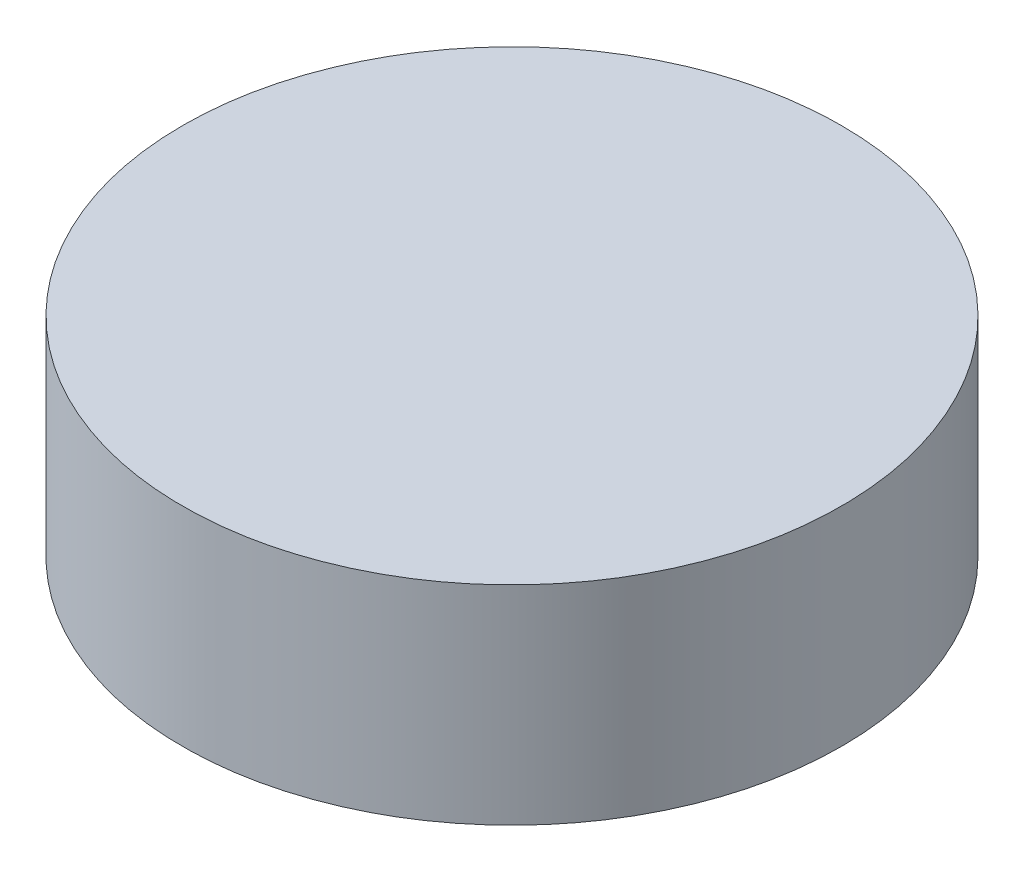
ISO-10303-21;
HEADER;
FILE_DESCRIPTION(('STEP AP214'),'2;1');
FILE_NAME('part.step','',(''),(''),'','','');
FILE_SCHEMA(('AUTOMOTIVE_DESIGN { 1 0 10303 214 1 1 1 1 }'));
ENDSEC;
DATA;
#1=APPLICATION_CONTEXT('core data for automotive mechanical design processes');
#2=APPLICATION_PROTOCOL_DEFINITION('international standard','automotive_design',2000,#1);
#3=PRODUCT_CONTEXT('',#1,'mechanical');
#4=PRODUCT('Part','Part','',(#3));
#5=PRODUCT_RELATED_PRODUCT_CATEGORY('part','',(#4));
#6=PRODUCT_DEFINITION_FORMATION('','',#4);
#7=PRODUCT_DEFINITION_CONTEXT('part definition',#1,'design');
#8=PRODUCT_DEFINITION('design','',#6,#7);
#9=PRODUCT_DEFINITION_SHAPE('','',#8);
#10=(LENGTH_UNIT() NAMED_UNIT(*) SI_UNIT(.MILLI.,.METRE.));
#11=(NAMED_UNIT(*) PLANE_ANGLE_UNIT() SI_UNIT($,.RADIAN.));
#12=(NAMED_UNIT(*) SI_UNIT($,.STERADIAN.) SOLID_ANGLE_UNIT());
#13=UNCERTAINTY_MEASURE_WITH_UNIT(LENGTH_MEASURE(1.E-05),#10,'distance_accuracy_value','');
#14=(GEOMETRIC_REPRESENTATION_CONTEXT(3) GLOBAL_UNCERTAINTY_ASSIGNED_CONTEXT((#13)) GLOBAL_UNIT_ASSIGNED_CONTEXT((#10,
#11,#12)) REPRESENTATION_CONTEXT('',''));
#15=CARTESIAN_POINT('',(0.,0.,0.));
#16=DIRECTION('',(0.,0.,1.));
#17=DIRECTION('',(1.,0.,0.));
#18=AXIS2_PLACEMENT_3D('',#15,#16,#17);
#19=CARTESIAN_POINT('',(118.839586852366,173.620644372415,206.575619137007));
#20=CARTESIAN_POINT('',(119.011400728294,173.620644372415,206.575633664712));
#21=CARTESIAN_POINT('',(119.355113670707,173.620644372415,206.608537742914));
#22=CARTESIAN_POINT('',(119.85025909914,173.620644372414,206.7601771893));
#23=CARTESIAN_POINT('',(120.307765165557,173.620644372415,207.003063848628));
#24=CARTESIAN_POINT('',(120.707167775394,173.620644372414,207.332676578562));
#25=CARTESIAN_POINT('',(121.036938844938,173.620644372415,207.732180481624));
#26=CARTESIAN_POINT('',(121.279799021076,173.620644372414,208.189550617574));
#27=CARTESIAN_POINT('',(121.431584877748,173.620644372415,208.684841239645));
#28=CARTESIAN_POINT('',(121.4809302787,173.620644372414,209.200334922429));
#29=CARTESIAN_POINT('',(121.431622655679,173.620644372415,209.716009667283));
#30=CARTESIAN_POINT('',(121.279940957434,173.620644372414,210.211147412403));
#31=CARTESIAN_POINT('',(121.037046475684,173.620644372415,210.668699540159));
#32=CARTESIAN_POINT('',(120.707429846536,173.620644372414,211.068101096819));
#33=CARTESIAN_POINT('',(120.307926987788,173.620644372414,211.39787244844));
#34=CARTESIAN_POINT('',(119.850556571883,173.620644372414,211.640732548962));
#35=CARTESIAN_POINT('',(119.355266024791,173.620644372414,211.792518425888));
#36=CARTESIAN_POINT('',(118.839772321899,173.620644372414,211.841863821407));
#37=CARTESIAN_POINT('',(118.324097582431,173.620644372414,211.792556199842));
#38=CARTESIAN_POINT('',(117.828959835864,173.620644372414,211.640874501203));
#39=CARTESIAN_POINT('',(117.371407708505,173.620644372414,211.397980019546));
#40=CARTESIAN_POINT('',(116.972006151745,173.620644372414,211.068363390402));
#41=CARTESIAN_POINT('',(116.642234800128,173.620644372414,210.668860531562));
#42=CARTESIAN_POINT('',(116.399374699704,173.620644372414,210.211490116043));
#43=CARTESIAN_POINT('',(116.247588822395,173.620644372414,209.716199567506));
#44=CARTESIAN_POINT('',(116.198243428329,173.620644372414,209.200705870021));
#45=CARTESIAN_POINT('',(116.247551044449,173.620644372414,208.685031110398));
#46=CARTESIAN_POINT('',(116.399232763416,173.620644372414,208.189893439078));
#47=CARTESIAN_POINT('',(116.642127169246,173.620644372414,207.732341031012));
#48=CARTESIAN_POINT('',(116.971744081505,173.620644372414,207.332940522311));
#49=CARTESIAN_POINT('',(117.371245884253,173.620644372415,207.003165261049));
#50=CARTESIAN_POINT('',(117.828662419759,173.620644372414,206.760297364195));
#51=CARTESIAN_POINT('',(118.323945251045,173.620644372414,206.608469086862));
#52=CARTESIAN_POINT('',(118.667677955006,173.620644372415,206.575604601267));
#53=CARTESIAN_POINT('',(118.839586852366,173.620644372415,206.575619137007));
#54=B_SPLINE_CURVE_WITH_KNOTS('',3,(#19,#20,#21,#22,#23,#24,#25,#26,#27,#28,#29,#30,#31,#32,#33,
#34,#35,#36,#37,#38,#39,#40,#41,#42,#43,#44,#45,#46,#47,#48,#49,#50,#51,#52,#53),.UNSPECIFIED.,
.T.,.F.,(4,1,1,1,1,1,1,1,1,1,1,1,1,1,1,1,1,1,1,1,1,1,1,1,1,1,1,1,1,1,1,1,4),(0.,
0.0312413569188765,0.0624996653087882,0.0937327224681811,0.124999665238835,0.156232722397082,
0.187499665168914,0.218732722326993,0.249999665098999,0.281232722256907,0.31249966502908,
0.343732722187167,0.374999664959178,0.406232722117624,0.437499664889266,0.468732722048057,
0.499999664819363,0.531232721978932,0.562499664749468,0.593732721908671,0.624999664679522,
0.65623272183825,0.68749966460962,0.718732721768162,0.749999664539686,0.781232721698474,
0.812499664469802,0.8437327216291,0.874999664399879,0.906232721559641,0.93749966432999,
0.968741365090905,1.),.UNSPECIFIED.);
#55=DIRECTION('',(0.,-1.,0.));
#56=VECTOR('',#55,1.);
#57=SURFACE_OF_LINEAR_EXTRUSION('',#54,#56);
#58=CARTESIAN_POINT('',(118.839586819237,173.620644372414,206.575619137004));
#59=CARTESIAN_POINT('',(118.873958134056,173.620644372414,206.57562210794));
#60=CARTESIAN_POINT('',(118.908329898704,173.620644372414,206.576282602033));
#61=CARTESIAN_POINT('',(118.97701892004,173.620644372414,206.578928851347));
#62=CARTESIAN_POINT('',(119.011336181743,173.620644372414,206.580914476634));
#63=CARTESIAN_POINT('',(119.079862359489,173.620644372414,206.5862207978));
#64=CARTESIAN_POINT('',(119.114071291156,173.620644372414,206.589541291418));
#65=CARTESIAN_POINT('',(119.182326555705,173.620644372414,206.597527191342));
#66=CARTESIAN_POINT('',(119.21637291325,173.620644372414,206.602192386598));
#67=CARTESIAN_POINT('',(119.28424899359,173.620644372414,206.612877481596));
#68=CARTESIAN_POINT('',(119.318078739066,173.620644372414,206.61889723704));
#69=CARTESIAN_POINT('',(119.385466972912,173.620644372414,206.632300997284));
#70=CARTESIAN_POINT('',(119.419025460525,173.620644372414,206.639685005896));
#71=CARTESIAN_POINT('',(119.485824330512,173.620644372414,206.65578735797));
#72=CARTESIAN_POINT('',(119.519064677642,173.620644372414,206.664505847489));
#73=CARTESIAN_POINT('',(119.585180936081,173.620644372414,206.683247475732));
#74=CARTESIAN_POINT('',(119.618056789501,173.620644372414,206.693270818558));
#75=CARTESIAN_POINT('',(119.683397614312,173.620644372414,206.714592529377));
#76=CARTESIAN_POINT('',(119.71586252394,173.620644372414,206.725891086556));
#77=CARTESIAN_POINT('',(119.780334974551,173.620644372414,206.749733659134));
#78=CARTESIAN_POINT('',(119.812342472652,173.620644372414,206.762277790437));
#79=CARTESIAN_POINT('',(119.875853812011,173.620644372414,206.788582102222));
#80=CARTESIAN_POINT('',(119.907357653416,173.620644372414,206.802342282351));
#81=CARTESIAN_POINT('',(119.969807933525,173.620644372414,206.83106719086));
#82=CARTESIAN_POINT('',(120.000754424424,173.620644372414,206.846031805723));
#83=CARTESIAN_POINT('',(120.062036018224,173.620644372414,206.877153955306));
#84=CARTESIAN_POINT('',(120.092371211881,173.620644372414,206.89331131126));
#85=CARTESIAN_POINT('',(120.152376269735,173.620644372414,206.92680725957));
#86=CARTESIAN_POINT('',(120.182046237537,173.620644372414,206.944145666262));
#87=CARTESIAN_POINT('',(120.240666999149,173.620644372414,206.979992059081));
#88=CARTESIAN_POINT('',(120.269617870383,173.620644372414,206.998499918528));
#89=CARTESIAN_POINT('',(120.32674622174,173.620644372414,207.036673088376));
#90=CARTESIAN_POINT('',(120.354923701478,173.620644372414,207.056338399352));
#91=CARTESIAN_POINT('',(120.410473680635,173.620644372414,207.096780555853));
#92=CARTESIAN_POINT('',(120.437846091613,173.620644372414,207.117557522797));
#93=CARTESIAN_POINT('',(120.491754743097,173.620644372414,207.160177540275));
#94=CARTESIAN_POINT('',(120.518290850587,173.620644372414,207.182020759006));
#95=CARTESIAN_POINT('',(120.570495578528,173.620644372414,207.226727833512));
#96=CARTESIAN_POINT('',(120.596164067759,173.620644372414,207.249591842469));
#97=CARTESIAN_POINT('',(120.646602179985,173.620644372414,207.296295091098));
#98=CARTESIAN_POINT('',(120.671371718085,173.620644372414,207.320134422426));
#99=CARTESIAN_POINT('',(120.719980682547,173.620644372414,207.368743144521));
#100=CARTESIAN_POINT('',(120.743820110013,173.620644372414,207.393512534184));
#101=CARTESIAN_POINT('',(120.790523453261,173.620644372414,207.443950354582));
#102=CARTESIAN_POINT('',(120.813387462656,173.620644372414,207.469618698611));
#103=CARTESIAN_POINT('',(120.858094399393,173.620644372414,207.521823199361));
#104=CARTESIAN_POINT('',(120.87993748123,173.620644372414,207.548359223737));
#105=CARTESIAN_POINT('',(120.922557055788,173.620644372414,207.602267823083));
#106=CARTESIAN_POINT('',(120.943333717053,173.620644372414,207.629640264761));
#107=CARTESIAN_POINT('',(120.983775023389,173.620644372414,207.685190498145));
#108=CARTESIAN_POINT('',(121.0034397889,173.620644372414,207.713368202126));
#109=CARTESIAN_POINT('',(121.041611705294,173.620644372414,207.770497165046));
#110=CARTESIAN_POINT('',(121.060118854157,173.620644372414,207.799448425333));
#111=CARTESIAN_POINT('',(121.095963970016,173.620644372414,207.858069951767));
#112=CARTESIAN_POINT('',(121.113301807016,173.620644372414,207.887740297359));
#113=CARTESIAN_POINT('',(121.146796914772,173.620644372414,207.947746021489));
#114=CARTESIAN_POINT('',(121.162953996774,173.620644372414,207.978081505352));
#115=CARTESIAN_POINT('',(121.19407609125,173.620644372414,208.039363488099));
#116=CARTESIAN_POINT('',(121.20904092296,173.620644372414,208.070310078752));
#117=CARTESIAN_POINT('',(121.237766940125,173.620644372414,208.132760270449));
#118=CARTESIAN_POINT('',(121.251528011985,173.620644372414,208.164263923725));
#119=CARTESIAN_POINT('',(121.277834968325,173.620644372414,208.227774510877));
#120=CARTESIAN_POINT('',(121.290380854992,173.620644372414,208.259781443846));
#121=CARTESIAN_POINT('',(121.314227354229,173.620644372414,208.324252567191));
#122=CARTESIAN_POINT('',(121.325528087286,173.620644372414,208.356716712981));
#123=CARTESIAN_POINT('',(121.346854118255,173.620644372414,208.422055983943));
#124=CARTESIAN_POINT('',(121.356879610171,173.620644372414,208.454931045764));
#125=CARTESIAN_POINT('',(121.375625069264,173.620644372414,208.521045864024));
#126=CARTESIAN_POINT('',(121.384345243521,173.620644372414,208.554285561716));
#127=CARTESIAN_POINT('',(121.400450028087,173.620644372414,208.621083454412));
#128=CARTESIAN_POINT('',(121.407834783256,173.620644372414,208.654641614456));
#129=CARTESIAN_POINT('',(121.42123875942,173.620644372414,208.722029617339));
#130=CARTESIAN_POINT('',(121.427257977719,173.620644372414,208.755859460716));
#131=CARTESIAN_POINT('',(121.43794107181,173.620644372414,208.823736005418));
#132=CARTESIAN_POINT('',(121.442604796777,173.620644372414,208.857782730446));
#133=CARTESIAN_POINT('',(121.450587043586,173.620644372414,208.926038814098));
#134=CARTESIAN_POINT('',(121.453905350508,173.620644372414,208.960248197823));
#135=CARTESIAN_POINT('',(121.459206807997,173.620644372414,209.028775287364));
#136=CARTESIAN_POINT('',(121.461189756319,173.620644372414,209.063093008797));
#137=CARTESIAN_POINT('',(121.463830470424,173.620644372414,209.131782446426));
#138=CARTESIAN_POINT('',(121.46448811127,173.620644372414,209.166154167407));
#139=CARTESIAN_POINT('',(121.464488111899,173.620644372414,209.234897545085));
#140=CARTESIAN_POINT('',(121.463830474153,173.620644372414,209.269269201783));
#141=CARTESIAN_POINT('',(121.461189732611,173.620644372414,209.337958417543));
#142=CARTESIAN_POINT('',(121.459206757296,173.620644372414,209.372275981527));
#143=CARTESIAN_POINT('',(121.453905184574,173.620644372414,209.440802715296));
#144=CARTESIAN_POINT('',(121.450586790719,173.620644372414,209.475011900799));
#145=CARTESIAN_POINT('',(121.442604293466,173.620644372414,209.543267602171));
#146=CARTESIAN_POINT('',(121.437940403904,173.620644372414,209.577314143015));
#147=CARTESIAN_POINT('',(121.427256840865,173.620644372414,209.645190379715));
#148=CARTESIAN_POINT('',(121.421237314599,173.620644372414,209.679020098707));
#149=CARTESIAN_POINT('',(121.407832703776,173.620644372414,209.746407972305));
#150=CARTESIAN_POINT('',(121.400447616488,173.620644372414,209.779966126368));
#151=CARTESIAN_POINT('',(121.38434228023,173.620644372414,209.846764118705));
#152=CARTESIAN_POINT('',(121.375621882813,173.620644372414,209.88000392115));
#153=CARTESIAN_POINT('',(121.35687604481,173.620644372414,209.946118993415));
#154=CARTESIAN_POINT('',(121.346850396035,173.620644372414,209.978994204172));
#155=CARTESIAN_POINT('',(121.32552412162,173.620644372414,210.04433376026));
#156=CARTESIAN_POINT('',(121.314223303144,173.620644372414,210.076798042622));
#157=CARTESIAN_POINT('',(121.290376694284,173.620644372414,210.141269366585));
#158=CARTESIAN_POINT('',(121.277830786643,173.620644372414,210.173276364795));
#159=CARTESIAN_POINT('',(121.251523834888,173.620644372414,210.236786965356));
#160=CARTESIAN_POINT('',(121.237762793064,173.620644372414,210.268290568655));
#161=CARTESIAN_POINT('',(121.209036840875,173.620644372414,210.330740561463));
#162=CARTESIAN_POINT('',(121.194072047335,173.620644372414,210.36168700469));
#163=CARTESIAN_POINT('',(121.162949987102,173.620644372414,210.422968627387));
#164=CARTESIAN_POINT('',(121.146792902457,173.620644372414,210.453303899278));
#165=CARTESIAN_POINT('',(121.11329771068,173.620644372414,210.513309175103));
#166=CARTESIAN_POINT('',(121.095959791554,173.620644372414,210.542979283943));
#167=CARTESIAN_POINT('',(121.06011435527,173.620644372414,210.60160032694));
#168=CARTESIAN_POINT('',(121.041606965265,173.620644372414,210.630551338804));
#169=CARTESIAN_POINT('',(121.003434497046,173.620644372414,210.687679893277));
#170=CARTESIAN_POINT('',(120.983769416515,173.620644372414,210.715857434336));
#171=CARTESIAN_POINT('',(120.943327541042,173.620644372414,210.771407486809));
#172=CARTESIAN_POINT('',(120.922550622662,173.620644372414,210.798779908312));
#173=CARTESIAN_POINT('',(120.879930583801,173.620644372414,210.85268854872));
#174=CARTESIAN_POINT('',(120.858087293579,173.620644372414,210.879224633388));
#175=CARTESIAN_POINT('',(120.813380019484,173.620644372414,210.93142930006));
#176=CARTESIAN_POINT('',(120.790515881551,173.620644372414,210.957097750092));
#177=CARTESIAN_POINT('',(120.743812380087,173.620644372414,211.007535784653));
#178=CARTESIAN_POINT('',(120.719972924829,173.620644372414,211.032305284222));
#179=CARTESIAN_POINT('',(120.671364015863,173.620644372414,211.080914193614));
#180=CARTESIAN_POINT('',(120.646594563909,173.620644372414,211.104753605191));
#181=CARTESIAN_POINT('',(120.596156666991,173.620644372414,211.151456929371));
#182=CARTESIAN_POINT('',(120.570488309405,173.620644372414,211.17432093631));
#183=CARTESIAN_POINT('',(120.518283813212,173.620644372414,211.219027876383));
#184=CARTESIAN_POINT('',(120.491747807428,173.620644372414,211.240870964571));
#185=CARTESIAN_POINT('',(120.437839260388,173.620644372414,211.283490555753));
#186=CARTESIAN_POINT('',(120.410466852679,173.620644372414,211.304267227615));
#187=CARTESIAN_POINT('',(120.354916685816,173.620644372414,211.344708554779));
#188=CARTESIAN_POINT('',(120.326739014398,173.620644372414,211.364373330534));
#189=CARTESIAN_POINT('',(120.269610100987,173.620644372414,211.402545261534));
#190=CARTESIAN_POINT('',(120.240658857446,173.620644372414,211.421052414461));
#191=CARTESIAN_POINT('',(120.182037351681,173.620644372414,211.456897535222));
#192=CARTESIAN_POINT('',(120.152367009821,173.620644372414,211.47423537275));
#193=CARTESIAN_POINT('',(120.092361284682,173.620644372414,211.507730479463));
#194=CARTESIAN_POINT('',(120.062025795953,173.620644372414,211.523887559672));
#195=CARTESIAN_POINT('',(120.000743799419,173.620644372414,211.555009649588));
#196=CARTESIAN_POINT('',(119.969797199784,173.620644372414,211.569974478411));
#197=CARTESIAN_POINT('',(119.90734699048,173.620644372414,211.598700489936));
#198=CARTESIAN_POINT('',(119.875843328581,173.620644372414,211.612461559043));
#199=CARTESIAN_POINT('',(119.812332728185,173.620644372414,211.638768511378));
#200=CARTESIAN_POINT('',(119.780325790639,173.620644372414,211.651314396898));
#201=CARTESIAN_POINT('',(119.715854661603,173.620644372414,211.675160894668));
#202=CARTESIAN_POINT('',(119.683390514737,173.620644372414,211.686461627511));
#203=CARTESIAN_POINT('',(119.618051243912,173.620644372414,211.707787658589));
#204=CARTESIAN_POINT('',(119.585176183329,173.620644372414,211.717813150904));
#205=CARTESIAN_POINT('',(119.519061368645,173.620644372414,211.736558611036));
#206=CARTESIAN_POINT('',(119.485821673302,173.620644372414,211.745278785974));
#207=CARTESIAN_POINT('',(119.419023785215,173.620644372414,211.761383571853));
#208=CARTESIAN_POINT('',(119.385465627432,173.620644372414,211.768768327654));
#209=CARTESIAN_POINT('',(119.318077628037,173.620644372414,211.782172304718));
#210=CARTESIAN_POINT('',(119.284247785881,173.620644372414,211.788191523248));
#211=CARTESIAN_POINT('',(119.216371242689,173.620644372414,211.798874617592));
#212=CARTESIAN_POINT('',(119.182324517945,173.620644372414,211.803538342544));
#213=CARTESIAN_POINT('',(119.114068434247,173.620644372414,211.811520589188));
#214=CARTESIAN_POINT('',(119.079859050189,173.620644372414,211.814838895934));
#215=CARTESIAN_POINT('',(119.011331959686,173.620644372414,211.82014035301));
#216=CARTESIAN_POINT('',(118.977014237622,173.620644372414,211.822123301084));
#217=CARTESIAN_POINT('',(118.908324798756,173.620644372414,211.824764014706));
#218=CARTESIAN_POINT('',(118.873953077168,173.620644372414,211.825421655317));
#219=CARTESIAN_POINT('',(118.80520969855,173.620644372414,211.825421655562));
#220=CARTESIAN_POINT('',(118.770838041521,173.620644372414,211.824764017676));
#221=CARTESIAN_POINT('',(118.70214882535,173.620644372414,211.82212327591));
#222=CARTESIAN_POINT('',(118.667831261289,173.620644372414,211.820140300521));
#223=CARTESIAN_POINT('',(118.599304527536,173.620644372414,211.814838727686));
#224=CARTESIAN_POINT('',(118.565095342124,173.620644372414,211.811520333801));
#225=CARTESIAN_POINT('',(118.496839641021,173.620644372414,211.8035378365));
#226=CARTESIAN_POINT('',(118.462793100352,173.620644372414,211.798873946926));
#227=CARTESIAN_POINT('',(118.394916864001,173.620644372414,211.788190383858));
#228=CARTESIAN_POINT('',(118.361087145183,173.620644372414,211.782170857575));
#229=CARTESIAN_POINT('',(118.29369927186,173.620644372414,211.7687662467));
#230=CARTESIAN_POINT('',(118.2601411179,173.620644372414,211.761381159374));
#231=CARTESIAN_POINT('',(118.193343125703,173.620644372414,211.745275823026));
#232=CARTESIAN_POINT('',(118.160103323295,173.620644372414,211.736555425555));
#233=CARTESIAN_POINT('',(118.093988251062,173.620644372414,211.717809587434));
#234=CARTESIAN_POINT('',(118.061113040299,173.620644372414,211.707783938594));
#235=CARTESIAN_POINT('',(117.995773484179,173.620644372414,211.686457664047));
#236=CARTESIAN_POINT('',(117.963309201792,173.620644372414,211.675156845502));
#237=CARTESIAN_POINT('',(117.898837877782,173.620644372414,211.651310236507));
#238=CARTESIAN_POINT('',(117.866830879549,173.620644372414,211.6387643288));
#239=CARTESIAN_POINT('',(117.803320278966,173.620644372414,211.612457376917));
#240=CARTESIAN_POINT('',(117.771816675667,173.620644372414,211.598696335032));
#241=CARTESIAN_POINT('',(117.709366682878,173.620644372414,211.569970382726));
#242=CARTESIAN_POINT('',(117.678420239672,173.620644372414,211.555005589131));
#243=CARTESIAN_POINT('',(117.61713861703,173.620644372414,211.523883528789));
#244=CARTESIAN_POINT('',(117.586803345174,173.620644372414,211.507726444092));
#245=CARTESIAN_POINT('',(117.526798069428,173.620644372414,211.474231252214));
#246=CARTESIAN_POINT('',(117.49712796063,173.620644372414,211.456893333038));
#247=CARTESIAN_POINT('',(117.438506917723,173.620644372414,211.421047896656));
#248=CARTESIAN_POINT('',(117.409555905904,173.620644372414,211.402540506602));
#249=CARTESIAN_POINT('',(117.352427351518,173.620644372414,211.364368038286));
#250=CARTESIAN_POINT('',(117.324249810501,173.620644372414,211.344702957706));
#251=CARTESIAN_POINT('',(117.268699758108,173.620644372414,211.304261082138));
#252=CARTESIAN_POINT('',(117.241327336644,173.620644372414,211.283484163711));
#253=CARTESIAN_POINT('',(117.18741869631,173.620644372414,211.240864124756));
#254=CARTESIAN_POINT('',(117.160882611679,173.620644372414,211.219020834488));
#255=CARTESIAN_POINT('',(117.108677945079,173.620644372414,211.174313560302));
#256=CARTESIAN_POINT('',(117.083009495083,173.620644372414,211.151449422323));
#257=CARTESIAN_POINT('',(117.032571460595,173.620644372414,211.104745920768));
#258=CARTESIAN_POINT('',(117.007801961063,173.620644372414,211.080906465465));
#259=CARTESIAN_POINT('',(116.959193051748,173.620644372414,211.03229755641));
#260=CARTESIAN_POINT('',(116.93535364021,173.620644372414,211.007528104412));
#261=CARTESIAN_POINT('',(116.888650316114,173.620644372414,210.957090207407));
#262=CARTESIAN_POINT('',(116.865786309219,173.620644372414,210.931421849777));
#263=CARTESIAN_POINT('',(116.821079369236,173.620644372414,210.879217353502));
#264=CARTESIAN_POINT('',(116.799236281095,173.620644372414,210.852681347678));
#265=CARTESIAN_POINT('',(116.75661669001,173.620644372414,210.798772800564));
#266=CARTESIAN_POINT('',(116.735840018197,173.620644372414,210.771400392819));
#267=CARTESIAN_POINT('',(116.695398691137,173.620644372414,210.715850225893));
#268=CARTESIAN_POINT('',(116.675733915436,173.620644372414,210.687672554446));
#269=CARTESIAN_POINT('',(116.637561984545,173.620644372414,210.630543640984));
#270=CARTESIAN_POINT('',(116.619054831673,173.620644372414,210.601592397422));
#271=CARTESIAN_POINT('',(116.583209711024,173.620644372414,210.542970891617));
#272=CARTESIAN_POINT('',(116.565871873552,173.620644372414,210.513300549739));
#273=CARTESIAN_POINT('',(116.532376766948,173.620644372414,210.453294824558));
#274=CARTESIAN_POINT('',(116.516219686794,173.620644372414,210.422959335807));
#275=CARTESIAN_POINT('',(116.485097596985,173.620644372414,210.361677339218));
#276=CARTESIAN_POINT('',(116.470132768214,173.620644372414,210.330730739551));
#277=CARTESIAN_POINT('',(116.441406756788,173.620644372414,210.268280530168));
#278=CARTESIAN_POINT('',(116.427645687728,173.620644372414,210.23677686822));
#279=CARTESIAN_POINT('',(116.401338735484,173.620644372414,210.173266267711));
#280=CARTESIAN_POINT('',(116.388792850008,173.620644372414,210.1412593301));
#281=CARTESIAN_POINT('',(116.364946352326,173.620644372414,210.076788200933));
#282=CARTESIAN_POINT('',(116.353645619527,173.620644372414,210.044324054003));
#283=CARTESIAN_POINT('',(116.332319588546,173.620644372414,209.978984783074));
#284=CARTESIAN_POINT('',(116.322294096283,173.620644372414,209.94610972245));
#285=CARTESIAN_POINT('',(116.303548636268,173.620644372414,209.879994907731));
#286=CARTESIAN_POINT('',(116.294828461394,173.620644372414,209.846755212395));
#287=CARTESIAN_POINT('',(116.278723675664,173.620644372414,209.779957324392));
#288=CARTESIAN_POINT('',(116.271338919947,173.620644372414,209.746399166687));
#289=CARTESIAN_POINT('',(116.257934943074,173.620644372414,209.67901116752));
#290=CARTESIAN_POINT('',(116.251915724649,173.620644372414,209.645181325516));
#291=CARTESIAN_POINT('',(116.241232630519,173.620644372414,209.577304782635));
#292=CARTESIAN_POINT('',(116.236568905675,173.620644372414,209.543258058051));
#293=CARTESIAN_POINT('',(116.228586659224,173.620644372414,209.475001974593));
#294=CARTESIAN_POINT('',(116.225268352566,173.620644372414,209.440792590614));
#295=CARTESIAN_POINT('',(116.219966895616,173.620644372414,209.372265500106));
#296=CARTESIAN_POINT('',(116.217983947586,173.620644372414,209.337947777957));
#297=CARTESIAN_POINT('',(116.215343233977,173.620644372414,209.26925833867));
#298=CARTESIAN_POINT('',(116.214685593344,173.620644372414,209.234886616746));
#299=CARTESIAN_POINT('',(116.214685592949,173.620644372414,209.166143237185));
#300=CARTESIAN_POINT('',(116.215343230717,173.620644372414,209.131771579549));
#301=CARTESIAN_POINT('',(116.217983972235,173.620644372414,209.063082362148));
#302=CARTESIAN_POINT('',(116.219966947494,173.620644372414,209.028764797462));
#303=CARTESIAN_POINT('',(116.225268520155,173.620644372414,208.960238062765));
#304=CARTESIAN_POINT('',(116.228586913985,173.620644372414,208.926028877033));
#305=CARTESIAN_POINT('',(116.236569411362,173.620644372414,208.857773175917));
#306=CARTESIAN_POINT('',(116.241233301044,173.620644372414,208.823726635554));
#307=CARTESIAN_POINT('',(116.251916864611,173.620644372414,208.755850400765));
#308=CARTESIAN_POINT('',(116.25793639125,173.620644372414,208.722020683198));
#309=CARTESIAN_POINT('',(116.271341003275,173.620644372414,208.654632813432));
#310=CARTESIAN_POINT('',(116.278726091358,173.620644372414,208.62107466177));
#311=CARTESIAN_POINT('',(116.294831429263,173.620644372414,208.554276674256));
#312=CARTESIAN_POINT('',(116.303551827535,173.620644372414,208.521036874234));
#313=CARTESIAN_POINT('',(116.322297666931,173.620644372414,208.454921805648));
#314=CARTESIAN_POINT('',(116.332323316285,173.620644372414,208.422046596158));
#315=CARTESIAN_POINT('',(116.353649591168,173.620644372414,208.35670704024));
#316=CARTESIAN_POINT('',(116.36495040961,173.620644372414,208.324242756808));
#317=CARTESIAN_POINT('',(116.388797017353,173.620644372414,208.259771427161));
#318=CARTESIAN_POINT('',(116.401342924017,173.620644372414,208.227764424375));
#319=CARTESIAN_POINT('',(116.427649872099,173.620644372414,208.164253810591));
#320=CARTESIAN_POINT('',(116.441410911329,173.620644372414,208.132750198687));
#321=CARTESIAN_POINT('',(116.470136858193,173.620644372414,208.070300188343));
#322=CARTESIAN_POINT('',(116.485101649,173.620644372414,208.039353736185));
#323=CARTESIAN_POINT('',(116.516223704987,173.620644372414,207.978072099851));
#324=CARTESIAN_POINT('',(116.532380787998,173.620644372414,207.947736823193));
#325=CARTESIAN_POINT('',(116.565875979057,173.620644372414,207.887731546618));
#326=CARTESIAN_POINT('',(116.583213898877,173.620644372414,207.858061441667));
#327=CARTESIAN_POINT('',(116.619059340422,173.620644372414,207.799440419738));
#328=CARTESIAN_POINT('',(116.637566734684,173.620644372414,207.77048942486));
#329=CARTESIAN_POINT('',(116.675739217904,173.620644372414,207.713360920403));
#330=CARTESIAN_POINT('',(116.695404308881,173.620644372414,207.685183412174));
#331=CARTESIAN_POINT('',(116.735846205552,173.620644372414,207.62963342669));
#332=CARTESIAN_POINT('',(116.7566231347,173.620644372414,207.602261039358));
#333=CARTESIAN_POINT('',(116.799243190499,173.620644372414,207.548352451572));
#334=CARTESIAN_POINT('',(116.821086487216,173.620644372414,207.521816385614));
#335=CARTESIAN_POINT('',(116.865793764894,173.620644372414,207.469611723615));
#336=CARTESIAN_POINT('',(116.888657900477,173.620644372414,207.443943260026));
#337=CARTESIAN_POINT('',(116.935361383036,173.620644372414,207.393505148804));
#338=CARTESIAN_POINT('',(116.959200822465,173.620644372414,207.368735586803));
#339=CARTESIAN_POINT('',(117.007809676406,173.620644372414,207.320126490104));
#340=CARTESIAN_POINT('',(117.032579089818,173.620644372414,207.296286954305));
#341=CARTESIAN_POINT('',(117.083016909075,173.620644372414,207.249583376818));
#342=CARTESIAN_POINT('',(117.108685227477,173.620644372414,207.226719240722));
#343=CARTESIAN_POINT('',(117.160889662548,173.620644372414,207.182012101109));
#344=CARTESIAN_POINT('',(117.187425645636,173.620644372414,207.160168941653));
#345=CARTESIAN_POINT('',(117.241334182008,173.620644372414,207.11754933017));
#346=CARTESIAN_POINT('',(117.268706600515,173.620644372414,207.09677270772));
#347=CARTESIAN_POINT('',(117.324256841631,173.620644372414,207.056331664425));
#348=CARTESIAN_POINT('',(117.352434575025,173.620644372414,207.036667121096));
#349=CARTESIAN_POINT('',(117.409563692982,173.620644372414,206.998495896111));
#350=CARTESIAN_POINT('',(117.438515077929,173.620644372414,206.97998921503));
#351=CARTESIAN_POINT('',(117.497136866268,173.620644372414,206.944145054614));
#352=CARTESIAN_POINT('',(117.526807349588,173.620644372414,206.926807706067));
#353=CARTESIAN_POINT('',(117.586813293222,173.620644372414,206.893313357529));
#354=CARTESIAN_POINT('',(117.617148860294,173.620644372414,206.877156548865));
#355=CARTESIAN_POINT('',(117.678430885475,173.620644372414,206.846034547111));
#356=CARTESIAN_POINT('',(117.709377437085,173.620644372414,206.831069538195));
#357=CARTESIAN_POINT('',(117.771827357811,173.620644372414,206.80234247809));
#358=CARTESIAN_POINT('',(117.803330780684,173.620644372414,206.788580543811));
#359=CARTESIAN_POINT('',(117.866840639714,173.620644372414,206.762270942132));
#360=CARTESIAN_POINT('',(117.898847075726,173.620644372414,206.749723274383));
#361=CARTESIAN_POINT('',(117.963317074523,173.620644372414,206.725872727691));
#362=CARTESIAN_POINT('',(117.995780592171,173.620644372414,206.714569726796));
#363=CARTESIAN_POINT('',(118.061118590322,173.620644372414,206.693239119305));
#364=CARTESIAN_POINT('',(118.093993006234,173.620644372414,206.683211314958));
#365=CARTESIAN_POINT('',(118.160106631244,173.620644372414,206.664461635153));
#366=CARTESIAN_POINT('',(118.193345780401,173.620644372414,206.655739548463));
#367=CARTESIAN_POINT('',(118.260142787757,173.620644372414,206.639631774469));
#368=CARTESIAN_POINT('',(118.293700610405,173.620644372414,206.632245939896));
#369=CARTESIAN_POINT('',(118.36108825,173.620644372414,206.618841117477));
#370=CARTESIAN_POINT('',(118.394918067706,173.620644372414,206.612822133448));
#371=CARTESIAN_POINT('',(118.462794760994,173.620644372414,206.602140580709));
#372=CARTESIAN_POINT('',(118.49684166074,173.620644372414,206.597478165795));
#373=CARTESIAN_POINT('',(118.565098204723,173.620644372414,206.589499339827));
#374=CARTESIAN_POINT('',(118.599307874385,173.620644372414,206.586183146537));
#375=CARTESIAN_POINT('',(118.667835436689,173.620644372414,206.580886430054));
#376=CARTESIAN_POINT('',(118.702153345024,173.620644372414,206.578906110433));
#377=CARTESIAN_POINT('',(118.770843299445,173.620644372414,206.576270984594));
#378=CARTESIAN_POINT('',(118.805215350276,173.620644372414,206.575616301895));
#379=CARTESIAN_POINT('',(118.839586819237,173.620644372414,206.575619137004));
#380=B_SPLINE_CURVE_WITH_KNOTS('',3,(#58,#59,#60,#61,#62,#63,#64,#65,#66,#67,#68,#69,#70,#71,
#72,#73,#74,#75,#76,#77,#78,#79,#80,#81,#82,#83,#84,#85,#86,#87,#88,#89,#90,#91,#92,#93,#94,#95,
#96,#97,#98,#99,#100,#101,#102,#103,#104,#105,#106,#107,#108,#109,#110,#111,#112,#113,#114,#115,
#116,#117,#118,#119,#120,#121,#122,#123,#124,#125,#126,#127,#128,#129,#130,#131,#132,#133,#134,
#135,#136,#137,#138,#139,#140,#141,#142,#143,#144,#145,#146,#147,#148,#149,#150,#151,#152,#153,
#154,#155,#156,#157,#158,#159,#160,#161,#162,#163,#164,#165,#166,#167,#168,#169,#170,#171,#172,
#173,#174,#175,#176,#177,#178,#179,#180,#181,#182,#183,#184,#185,#186,#187,#188,#189,#190,#191,
#192,#193,#194,#195,#196,#197,#198,#199,#200,#201,#202,#203,#204,#205,#206,#207,#208,#209,#210,
#211,#212,#213,#214,#215,#216,#217,#218,#219,#220,#221,#222,#223,#224,#225,#226,#227,#228,#229,
#230,#231,#232,#233,#234,#235,#236,#237,#238,#239,#240,#241,#242,#243,#244,#245,#246,#247,#248,
#249,#250,#251,#252,#253,#254,#255,#256,#257,#258,#259,#260,#261,#262,#263,#264,#265,#266,#267,
#268,#269,#270,#271,#272,#273,#274,#275,#276,#277,#278,#279,#280,#281,#282,#283,#284,#285,#286,
#287,#288,#289,#290,#291,#292,#293,#294,#295,#296,#297,#298,#299,#300,#301,#302,#303,#304,#305,
#306,#307,#308,#309,#310,#311,#312,#313,#314,#315,#316,#317,#318,#319,#320,#321,#322,#323,#324,
#325,#326,#327,#328,#329,#330,#331,#332,#333,#334,#335,#336,#337,#338,#339,#340,#341,#342,#343,
#344,#345,#346,#347,#348,#349,#350,#351,#352,#353,#354,#355,#356,#357,#358,#359,#360,#361,#362,
#363,#364,#365,#366,#367,#368,#369,#370,#371,#372,#373,#374,#375,#376,#377,#378,#379),
.UNSPECIFIED.,.F.,.F.,(4,2,2,2,2,2,2,2,2,2,2,2,2,2,2,2,2,2,2,2,2,2,2,2,2,2,2,2,2,2,2,2,2,2,2,2,
2,2,2,2,2,2,2,2,2,2,2,2,2,2,2,2,2,2,2,2,2,2,2,2,2,2,2,2,2,2,2,2,2,2,2,2,2,2,2,2,2,2,2,2,2,2,2,2,
2,2,2,2,2,2,2,2,2,2,2,2,2,2,2,2,2,2,2,2,2,2,2,2,2,2,2,2,2,2,2,2,2,2,2,2,2,2,2,2,2,2,2,2,2,2,2,2,
2,2,2,2,2,2,2,2,2,2,2,2,2,2,2,2,2,2,2,2,2,2,2,2,2,2,2,2,4),(0.,0.103108414629332,
0.206206720469092,0.309289410543534,0.412355930763608,0.515411476738789,0.618467310590489,
0.721534431827277,0.824617693952106,0.927716269161028,1.0308244469627,1.13393259479718,
1.23703103602062,1.34011405627362,1.44318090888197,1.54623661592184,1.64929237417926,
1.75235941154622,1.85544275999736,1.95854162966734,2.0616502104939,2.16475866910574,
2.26785720995308,2.37094009822363,2.47400664408342,2.57706200435284,2.68011754435184,
2.78318452249889,2.88626794086282,2.98936695867932,3.09247569511229,3.1955842459542,
3.29868281066898,3.40176567194805,3.50483216237358,3.60788746596306,3.71094297314527,
3.81400994298829,3.91709337059168,4.02019240700797,4.12330116211677,4.22640972359207,
4.32950829095952,4.43259114933794,4.5356576339904,4.63871293184797,4.74176843580175,
4.84483540484852,4.94791883331746,5.05101787143771,5.15412662822206,5.25723519063254,
5.36033375822868,5.46341661636136,5.56648310053354,5.66953839792279,5.77259390161742,
5.87566087060156,5.9787442991379,6.08184333738849,6.18495209429895,6.28806065677857,
6.39115922439134,6.49424208250612,6.59730856664416,6.70036386400077,6.80341936767776,
6.90648633665779,7.00956976519877,7.112668803458,7.21577756037657,7.31888612286054,
7.42198469047417,7.52506754858772,7.62813403272359,7.73118933007816,7.83424483375423,
7.93731180273417,8.04039523127557,8.14349426953541,8.2466030264545,8.34971158893866,
8.45281015655219,8.55589301466551,8.6589594988011,8.76201479615551,8.86507029983153,
8.96813726881158,9.0712206973531,9.17431973561318,9.27742849253251,9.38053705501694,
9.48363562263072,9.58671848074406,9.68978496487931,9.79284026223267,9.89589576590691,
9.99896273488508,10.1020461634257,10.2051452016869,10.3082539586106,10.4113625211031,
10.5144610887253,10.6175439468429,10.7206104309737,10.8236657283091,10.9267212319507,
11.029788200895,11.1328716294182,11.2359706676964,11.3390794246898,11.4421879873086,
11.5452865550611,11.6483694132456,11.7514358973125,11.8544911943868,11.957546697558,
12.0606136660212,12.1636970942989,12.2667961328079,12.3699048907403,12.4730134550402,
12.5761120245002,12.6791948835483,12.7822613668079,12.8853166606304,12.9883721580433,
13.0914391207182,13.1945225460959,13.2976215872778,13.4007303558872,13.5038389389239,
13.6069375270255,13.7100203952953,13.8130868701393,13.9161421309104,14.0191975713826,
14.1222644784761,14.2253478768646,14.3284469420931,14.4315558033074,14.5346645424571,
14.6377632790359,14.7408462170857,14.8439126319186,14.9469676728889,15.0500227650364,
15.153089364608,15.2561726310411,15.3592717966334,15.4623809699133,15.5654901135969,
15.6685891457045,15.7716721702626,15.8747385005286,15.9777934649114,16.0808487171433,
16.183915648397,16.2869992451696,16.3900985472115,16.493207455175),.UNSPECIFIED.);
#381=CARTESIAN_POINT('',(118.839586819237,173.620644372414,206.575619137004));
#382=VERTEX_POINT('',#381);
#383=EDGE_CURVE('E9',#382,#382,#380,.T.);
#384=ORIENTED_EDGE('',*,*,#383,.T.);
#385=EDGE_LOOP('',(#384));
#386=FACE_BOUND('',#385,.T.);
#387=CARTESIAN_POINT('',(118.839586819237,171.96234262404,206.575619137004));
#388=CARTESIAN_POINT('',(118.797925068568,171.96234262404,206.575615822306));
#389=CARTESIAN_POINT('',(118.756262011849,171.96234262404,206.576578364872));
#390=CARTESIAN_POINT('',(118.673032434455,171.96234262404,206.580454581893));
#391=CARTESIAN_POINT('',(118.63146590182,171.96234262404,206.583368000071));
#392=CARTESIAN_POINT('',(118.548525644557,171.96234262404,206.591164611518));
#393=CARTESIAN_POINT('',(118.507151883788,171.96234262404,206.596047419182));
#394=CARTESIAN_POINT('',(118.424693863766,171.96234262404,206.607800087593));
#395=CARTESIAN_POINT('',(118.383609557765,171.96234262404,206.614669619576));
#396=CARTESIAN_POINT('',(118.301828938373,171.96234262404,206.630418371455));
#397=CARTESIAN_POINT('',(118.261132614777,171.96234262404,206.639297538341));
#398=CARTESIAN_POINT('',(118.180212853467,171.96234262404,206.659017616861));
#399=CARTESIAN_POINT('',(118.139989481591,171.96234262404,206.669858798252));
#400=CARTESIAN_POINT('',(118.060097032178,171.96234262404,206.6934463345));
#401=CARTESIAN_POINT('',(118.020428066526,171.96234262404,206.706193068017));
#402=CARTESIAN_POINT('',(117.941727143363,171.96234262404,206.73353874477));
#403=CARTESIAN_POINT('',(117.902695288918,171.96234262404,206.748137984403));
#404=CARTESIAN_POINT('',(117.825349178352,171.96234262404,206.779131243385));
#405=CARTESIAN_POINT('',(117.78703495031,171.96234262404,206.79552533279));
#406=CARTESIAN_POINT('',(117.711216684668,171.96234262404,206.830081300488));
#407=CARTESIAN_POINT('',(117.673712560527,171.96234262404,206.848242988798));
#408=CARTESIAN_POINT('',(117.599612036847,171.96234262404,206.886316552047));
#409=CARTESIAN_POINT('',(117.56301546635,171.96234262404,206.906228094101));
#410=CARTESIAN_POINT('',(117.49082492787,171.96234262404,206.947779169889));
#411=CARTESIAN_POINT('',(117.455230778539,171.96234262404,206.969418388318));
#412=CARTESIAN_POINT('',(117.385146001508,171.96234262404,207.014411210489));
#413=CARTESIAN_POINT('',(117.35065529916,171.96234262404,207.037764697908));
#414=CARTESIAN_POINT('',(117.282848696214,171.96234262404,207.086125480246));
#415=CARTESIAN_POINT('',(117.249532919845,171.96234262404,207.111132949246));
#416=CARTESIAN_POINT('',(117.184128021428,171.96234262404,207.162715293717));
#417=CARTESIAN_POINT('',(117.152039135825,171.96234262404,207.18929046883));
#418=CARTESIAN_POINT('',(117.089145139382,171.96234262404,207.243929101602));
#419=CARTESIAN_POINT('',(117.058340255527,171.96234262404,207.271992820428));
#420=CARTESIAN_POINT('',(116.998067140715,171.96234262404,207.329524724064));
#421=CARTESIAN_POINT('',(116.968599010487,171.96234262404,207.358993014368));
#422=CARTESIAN_POINT('',(116.911067307793,171.96234262404,207.419266473487));
#423=CARTESIAN_POINT('',(116.883003633574,171.96234262404,207.450071545148));
#424=CARTESIAN_POINT('',(116.828364893493,171.96234262404,207.512965836301));
#425=CARTESIAN_POINT('',(116.801789569045,171.96234262404,207.545054831052));
#426=CARTESIAN_POINT('',(116.750206683524,171.96234262404,207.610459780873));
#427=CARTESIAN_POINT('',(116.725198823368,171.96234262404,207.643775499938));
#428=CARTESIAN_POINT('',(116.676836859853,171.96234262404,207.711581665129));
#429=CARTESIAN_POINT('',(116.653482579979,171.96234262404,207.746071985287));
#430=CARTESIAN_POINT('',(116.608488159053,171.96234262404,207.816155896067));
#431=CARTESIAN_POINT('',(116.586848128887,171.96234262404,207.851749557853));
#432=CARTESIAN_POINT('',(116.545295802291,171.96234262404,207.923939222541));
#433=CARTESIAN_POINT('',(116.525383815384,171.96234262404,207.960535403475));
#434=CARTESIAN_POINT('',(116.487310037829,171.96234262404,208.034635407296));
#435=CARTESIAN_POINT('',(116.46914857621,171.96234262404,208.072139399166));
#436=CARTESIAN_POINT('',(116.434594130015,171.96234262404,208.147957861021));
#437=CARTESIAN_POINT('',(116.418201335699,171.96234262404,208.186272417671));
#438=CARTESIAN_POINT('',(116.387211825784,171.96234262404,208.263619689698));
#439=CARTESIAN_POINT('',(116.372615045937,171.96234262404,208.302652379329));
#440=CARTESIAN_POINT('',(116.345274534775,171.96234262404,208.381355114928));
#441=CARTESIAN_POINT('',(116.332530515813,171.96234262404,208.421025060896));
#442=CARTESIAN_POINT('',(116.308947912378,171.96234262404,208.500919327772));
#443=CARTESIAN_POINT('',(116.298108955771,171.962342624039,208.54114353875));
#444=CARTESIAN_POINT('',(116.278391945074,171.962342624039,208.62206450171));
#445=CARTESIAN_POINT('',(116.269513619605,171.96234262404,208.662761187471));
#446=CARTESIAN_POINT('',(116.253764712444,171.96234262404,208.744541947269));
#447=CARTESIAN_POINT('',(116.246894171934,171.96234262404,208.785626029233));
#448=CARTESIAN_POINT('',(116.235138244919,171.96234262404,208.868083261188));
#449=CARTESIAN_POINT('',(116.23025317702,171.96234262404,208.909456456491));
#450=CARTESIAN_POINT('',(116.222451244405,171.96234262404,208.992395750106));
#451=CARTESIAN_POINT('',(116.219534762154,171.96234262404,209.033961884326));
#452=CARTESIAN_POINT('',(116.215651804801,171.96234262404,209.117190302566));
#453=CARTESIAN_POINT('',(116.214685592836,171.96234262404,209.158852598801));
#454=CARTESIAN_POINT('',(116.214685593457,171.96234262404,209.242177282592));
#455=CARTESIAN_POINT('',(116.21565181031,171.96234262404,209.283839670149));
#456=CARTESIAN_POINT('',(116.219534715355,171.96234262404,209.367068391808));
#457=CARTESIAN_POINT('',(116.222451145895,171.96234262404,209.408634737871));
#458=CARTESIAN_POINT('',(116.230252878404,171.96234262404,209.491574480196));
#459=CARTESIAN_POINT('',(116.235137798457,171.96234262404,209.532947912311));
#460=CARTESIAN_POINT('',(116.246893254593,171.96234262404,209.615405553626));
#461=CARTESIAN_POINT('',(116.253763467298,171.96234262404,209.656489808813));
#462=CARTESIAN_POINT('',(116.269511632057,171.96234262404,209.738270759843));
#463=CARTESIAN_POINT('',(116.278389533665,171.96234262404,209.778967465398));
#464=CARTESIAN_POINT('',(116.298105877103,171.96234262404,209.859888306544));
#465=CARTESIAN_POINT('',(116.308944584195,171.96234262404,209.900112377412));
#466=CARTESIAN_POINT('',(116.332526782167,171.96234262404,209.980006322369));
#467=CARTESIAN_POINT('',(116.345270644346,171.962342624039,210.019676086777));
#468=CARTESIAN_POINT('',(116.37261094177,171.962342624039,210.098378519545));
#469=CARTESIAN_POINT('',(116.387207668571,171.962342624039,210.137411086547));
#470=CARTESIAN_POINT('',(116.418197148155,171.962342624039,210.214758269342));
#471=CARTESIAN_POINT('',(116.434589972708,171.962342624039,210.253072856375));
#472=CARTESIAN_POINT('',(116.469144490108,171.962342624039,210.328891529237));
#473=CARTESIAN_POINT('',(116.487305998725,171.962342624039,210.366395698986));
#474=CARTESIAN_POINT('',(116.525379801695,171.962342624039,210.440496146984));
#475=CARTESIAN_POINT('',(116.545291768869,171.962342624039,210.477092593264));
#476=CARTESIAN_POINT('',(116.586843906843,171.962342624039,210.549282812808));
#477=CARTESIAN_POINT('',(116.608483765551,171.962342624039,210.584876765579));
#478=CARTESIAN_POINT('',(116.653477622333,171.962342624039,210.65496122985));
#479=CARTESIAN_POINT('',(116.676831502672,171.962342624039,210.689451816907));
#480=CARTESIAN_POINT('',(116.725192757007,171.962342624039,210.75725828817));
#481=CARTESIAN_POINT('',(116.750200301388,171.962342624039,210.790574050783));
#482=CARTESIAN_POINT('',(116.801782628005,171.962342624039,210.855978964625));
#483=CARTESIAN_POINT('',(116.828357707098,171.962342624039,210.888067881605));
#484=CARTESIAN_POINT('',(116.882996077929,171.962342624039,210.950961962839));
#485=CARTESIAN_POINT('',(116.911059629515,171.962342624039,210.981766901257));
#486=CARTESIAN_POINT('',(116.968591248865,171.962342624039,211.042040106342));
#487=CARTESIAN_POINT('',(116.998059422578,171.962342624039,211.071508271851));
#488=CARTESIAN_POINT('',(117.058332734842,171.962342624039,211.129040015742));
#489=CARTESIAN_POINT('',(117.089137777503,171.96234262404,211.157103694553));
#490=CARTESIAN_POINT('',(117.152032059346,171.96234262404,211.211742432608));
#491=CARTESIAN_POINT('',(117.184121074708,171.962342624039,211.238317749377));
#492=CARTESIAN_POINT('',(117.24952608781,171.962342624039,211.289900613122));
#493=CARTESIAN_POINT('',(117.282841849987,171.962342624039,211.314908458618));
#494=CARTESIAN_POINT('',(117.350648092316,171.962342624039,211.363270396661));
#495=CARTESIAN_POINT('',(117.38513844641,171.962342624039,211.386624665846));
#496=CARTESIAN_POINT('',(117.455222401984,171.962342624039,211.431619073751));
#497=CARTESIAN_POINT('',(117.490816074255,171.962342624039,211.453259102164));
#498=CARTESIAN_POINT('',(117.563005745758,171.962342624039,211.494811428233));
#499=CARTESIAN_POINT('',(117.599601922763,171.962342624039,211.514723416817));
#500=CARTESIAN_POINT('',(117.673701911881,171.962342624039,211.552797199516));
#501=CARTESIAN_POINT('',(117.711205892855,171.962342624039,211.570958664837));
#502=CARTESIAN_POINT('',(117.787024334193,171.962342624039,211.605513117756));
#503=CARTESIAN_POINT('',(117.82533888123,171.962342624039,211.621905915075));
#504=CARTESIAN_POINT('',(117.90268614003,171.962342624039,211.652895428757));
#505=CARTESIAN_POINT('',(117.941718826123,171.96234262404,211.667492209174));
#506=CARTESIAN_POINT('',(118.020421558772,171.96234262404,211.694832720635));
#507=CARTESIAN_POINT('',(118.060091505383,171.962342624039,211.707576739168));
#508=CARTESIAN_POINT('',(118.13998577564,171.962342624039,211.731159341252));
#509=CARTESIAN_POINT('',(118.180209989382,171.96234262404,211.741998296849));
#510=CARTESIAN_POINT('',(118.261130957824,171.96234262404,211.761715305616));
#511=CARTESIAN_POINT('',(118.301827646306,171.96234262404,211.770593630163));
#512=CARTESIAN_POINT('',(118.383608410016,171.96234262404,211.786342536027));
#513=CARTESIAN_POINT('',(118.42469249316,171.962342624039,211.793213076229));
#514=CARTESIAN_POINT('',(118.507149726274,171.962342624039,211.804969002868));
#515=CARTESIAN_POINT('',(118.548522921547,171.962342624039,211.809854070755));
#516=CARTESIAN_POINT('',(118.63146221446,171.962342624039,211.817656003481));
#517=CARTESIAN_POINT('',(118.673028348003,171.962342624039,211.820572485884));
#518=CARTESIAN_POINT('',(118.756256764819,171.962342624039,211.82445544354));
#519=CARTESIAN_POINT('',(118.797919060306,171.962342624039,211.825421655658));
#520=CARTESIAN_POINT('',(118.881243742978,171.962342624039,211.82542165522));
#521=CARTESIAN_POINT('',(118.922906130163,171.962342624039,211.824455438379));
#522=CARTESIAN_POINT('',(119.006134851421,171.962342624039,211.820572533285));
#523=CARTESIAN_POINT('',(119.047701197454,171.962342624039,211.817656102668));
#524=CARTESIAN_POINT('',(119.130640939907,171.962342624039,211.809854369967));
#525=CARTESIAN_POINT('',(119.172014372181,171.962342624039,211.80496944979));
#526=CARTESIAN_POINT('',(119.254472013849,171.96234262404,211.7932139934));
#527=CARTESIAN_POINT('',(119.29555626923,171.96234262404,211.786343780563));
#528=CARTESIAN_POINT('',(119.377337220553,171.96234262404,211.770595615568));
#529=CARTESIAN_POINT('',(119.418033926206,171.96234262404,211.761717713858));
#530=CARTESIAN_POINT('',(119.498954767448,171.96234262404,211.74200137024));
#531=CARTESIAN_POINT('',(119.539178838314,171.96234262404,211.731162663074));
#532=CARTESIAN_POINT('',(119.619072783204,171.96234262404,211.707580464966));
#533=CARTESIAN_POINT('',(119.65874254755,171.962342624039,211.69483660273));
#534=CARTESIAN_POINT('',(119.737444980173,171.962342624039,211.667496305193));
#535=CARTESIAN_POINT('',(119.776477547093,171.96234262404,211.65289957834));
#536=CARTESIAN_POINT('',(119.853824729744,171.96234262404,211.621910098646));
#537=CARTESIAN_POINT('',(119.892139316713,171.96234262404,211.605517274036));
#538=CARTESIAN_POINT('',(119.967957989474,171.96234262404,211.570962756518));
#539=CARTESIAN_POINT('',(120.005462159184,171.96234262404,211.552801247838));
#540=CARTESIAN_POINT('',(120.079562607118,171.96234262404,211.514727444739));
#541=CARTESIAN_POINT('',(120.116159053372,171.96234262404,211.494815477498));
#542=CARTESIAN_POINT('',(120.188349272867,171.96234262404,211.453263339391));
#543=CARTESIAN_POINT('',(120.223943225615,171.96234262404,211.431623480616));
#544=CARTESIAN_POINT('',(120.294027689831,171.96234262404,211.3866296237));
#545=CARTESIAN_POINT('',(120.328518276857,171.96234262404,211.363275743294));
#546=CARTESIAN_POINT('',(120.396324748046,171.96234262404,211.314914488832));
#547=CARTESIAN_POINT('',(120.429640510618,171.96234262404,211.289906944389));
#548=CARTESIAN_POINT('',(120.49504542437,171.96234262404,211.238324617655));
#549=CARTESIAN_POINT('',(120.527134341302,171.96234262404,211.211749538505));
#550=CARTESIAN_POINT('',(120.590028422434,171.96234262404,211.157111167566));
#551=CARTESIAN_POINT('',(120.620833360799,171.96234262404,211.129047615929));
#552=CARTESIAN_POINT('',(120.681106565778,171.96234262404,211.071515996481));
#553=CARTESIAN_POINT('',(120.710574731232,171.96234262404,211.042047822721));
#554=CARTESIAN_POINT('',(120.768106475014,171.96234262404,210.981774510368));
#555=CARTESIAN_POINT('',(120.796170153771,171.96234262404,210.950969467663));
#556=CARTESIAN_POINT('',(120.850808891714,171.96234262404,210.888075185733));
#557=CARTESIAN_POINT('',(120.877384208428,171.96234262404,210.855986170326));
#558=CARTESIAN_POINT('',(120.928967072059,171.96234262404,210.790581157134));
#559=CARTESIAN_POINT('',(120.953974917498,171.96234262404,210.75726539491));
#560=CARTESIAN_POINT('',(121.002336855425,171.96234262404,210.689459152481));
#561=CARTESIAN_POINT('',(121.025691124551,171.96234262404,210.654968798334));
#562=CARTESIAN_POINT('',(121.070685532337,171.96234262404,210.584884842653));
#563=CARTESIAN_POINT('',(121.09232556069,171.96234262404,210.549291170328));
#564=CARTESIAN_POINT('',(121.133877886637,171.96234262404,210.477101498724));
#565=CARTESIAN_POINT('',(121.153789875159,171.96234262404,210.440505321675));
#566=CARTESIAN_POINT('',(121.191863657728,171.96234262404,210.366405332486));
#567=CARTESIAN_POINT('',(121.210025122981,171.96234262404,210.328901351487));
#568=CARTESIAN_POINT('',(121.244579575757,171.96234262404,210.253082910131));
#569=CARTESIAN_POINT('',(121.260972373001,171.96234262404,210.2147683631));
#570=CARTESIAN_POINT('',(121.291961886526,171.96234262404,210.137421104338));
#571=CARTESIAN_POINT('',(121.30655866686,171.96234262404,210.098388418276));
#572=CARTESIAN_POINT('',(121.333899178159,171.96234262404,210.019685685677));
#573=CARTESIAN_POINT('',(121.34664319661,171.96234262404,209.980015739085));
#574=CARTESIAN_POINT('',(121.370225798548,171.96234262404,209.900121468812));
#575=CARTESIAN_POINT('',(121.381064754075,171.96234262404,209.859897255034));
#576=CARTESIAN_POINT('',(121.400781762732,171.96234262404,209.778976286428));
#577=CARTESIAN_POINT('',(121.409660087233,171.96234262404,209.738279597817));
#578=CARTESIAN_POINT('',(121.425408993039,171.96234262404,209.65649883376));
#579=CARTESIAN_POINT('',(121.432279533225,171.96234262404,209.615414750397));
#580=CARTESIAN_POINT('',(121.444035459825,171.96234262404,209.532957516888));
#581=CARTESIAN_POINT('',(121.448920527691,171.96234262404,209.491584321439));
#582=CARTESIAN_POINT('',(121.456722460319,171.96234262404,209.408645028369));
#583=CARTESIAN_POINT('',(121.459638942655,171.96234262404,209.367078894844));
#584=CARTESIAN_POINT('',(121.463521900073,171.96234262404,209.283850478414));
#585=CARTESIAN_POINT('',(121.464488112037,171.96234262404,209.242188183294));
#586=CARTESIAN_POINT('',(121.464488111132,171.96234262404,209.158863501737));
#587=CARTESIAN_POINT('',(121.463521893996,171.96234262404,209.117201115301));
#588=CARTESIAN_POINT('',(121.459638988313,171.96234262404,209.033972395478));
#589=CARTESIAN_POINT('',(121.456722557399,171.96234262404,208.992406050131));
#590=CARTESIAN_POINT('',(121.448920824296,171.96234262404,208.90946630841));
#591=CARTESIAN_POINT('',(121.444035903985,171.96234262404,208.868092876187));
#592=CARTESIAN_POINT('',(121.432280447673,171.96234262404,208.785635233415));
#593=CARTESIAN_POINT('',(121.425410234995,171.96234262404,208.744550976888));
#594=CARTESIAN_POINT('',(121.409662070993,171.96234262404,208.662770021731));
#595=CARTESIAN_POINT('',(121.400784170054,171.96234262404,208.622073313403));
#596=CARTESIAN_POINT('',(121.381067828069,171.96234262404,208.541152466768));
#597=CARTESIAN_POINT('',(121.370229121769,171.96234262404,208.500928393183));
#598=CARTESIAN_POINT('',(121.34664692473,171.96234262404,208.421034444996));
#599=CARTESIAN_POINT('',(121.333903062785,171.96234262404,208.381364680048));
#600=CARTESIAN_POINT('',(121.306562764679,171.96234262404,208.302662250449));
#601=CARTESIAN_POINT('',(121.291966037126,171.96234262404,208.263629687099));
#602=CARTESIAN_POINT('',(121.260976553415,171.96234262404,208.186282517732));
#603=CARTESIAN_POINT('',(121.244583725684,171.96234262404,208.147967940398));
#604=CARTESIAN_POINT('',(121.210029201203,171.96234262404,208.072149288214));
#605=CARTESIAN_POINT('',(121.191867688701,171.96234262404,208.034645129438));
#606=CARTESIAN_POINT('',(121.153793880208,171.96234262404,207.960544696335));
#607=CARTESIAN_POINT('',(121.13388191116,171.96234262404,207.923948254099));
#608=CARTESIAN_POINT('',(121.092329773298,171.96234262404,207.851758028053));
#609=CARTESIAN_POINT('',(121.070689916126,171.96234262404,207.816164064996));
#610=CARTESIAN_POINT('',(121.025696071882,171.96234262404,207.746079556444));
#611=CARTESIAN_POINT('',(121.002342201966,171.96234262404,207.711588935764));
#612=CARTESIAN_POINT('',(120.953980972624,171.96234262404,207.643782387928));
#613=CARTESIAN_POINT('',(120.928973442685,171.96234262404,207.610466582454));
#614=CARTESIAN_POINT('',(120.877391137459,171.96234262404,207.54506160572));
#615=CARTESIAN_POINT('',(120.850816065872,171.96234262404,207.512972668265));
#616=CARTESIAN_POINT('',(120.796177696782,171.96234262404,207.450078596446));
#617=CARTESIAN_POINT('',(120.768114140487,171.96234262404,207.419273687001));
#618=CARTESIAN_POINT('',(120.710582479818,171.96234262404,207.359000628463));
#619=CARTESIAN_POINT('',(120.681114270817,171.96234262404,207.329532579268));
#620=CARTESIAN_POINT('',(120.620840868303,171.96234262404,207.272001119073));
#621=CARTESIAN_POINT('',(120.590035771113,171.96234262404,207.243937607191));
#622=CARTESIAN_POINT('',(120.527141404375,171.96234262404,207.18929913099));
#623=CARTESIAN_POINT('',(120.495052357505,171.96234262404,207.162723910457));
#624=CARTESIAN_POINT('',(120.429647328491,171.96234262404,207.111141065906));
#625=CARTESIAN_POINT('',(120.396331579723,171.96234262404,207.086133146135));
#626=CARTESIAN_POINT('',(120.328525467664,171.96234262404,207.03777074017));
#627=CARTESIAN_POINT('',(120.294035227803,171.96234262404,207.014416081018));
#628=CARTESIAN_POINT('',(120.223951583201,171.96234262404,206.96942064375));
#629=CARTESIAN_POINT('',(120.188358106753,171.96234262404,206.947779977363));
#630=CARTESIAN_POINT('',(120.116168753204,171.96234262404,206.906226592066));
#631=CARTESIAN_POINT('',(120.079572700163,171.96234262404,206.886314179032));
#632=CARTESIAN_POINT('',(120.005472786899,171.96234262404,206.848240155657));
#633=CARTESIAN_POINT('',(119.967968760736,171.96234262404,206.830078868416));
#634=CARTESIAN_POINT('',(119.89214991396,171.96234262404,206.795525859358));
#635=CARTESIAN_POINT('',(119.853835009292,171.96234262404,206.779134322077));
#636=CARTESIAN_POINT('',(119.776486682113,171.96234262404,206.748148575024));
#637=CARTESIAN_POINT('',(119.737453285952,171.96234262404,206.73355429949));
#638=CARTESIAN_POINT('',(119.65874904834,171.96234262404,206.706219151591));
#639=CARTESIAN_POINT('',(119.619078305133,171.96234262404,206.693477996563));
#640=CARTESIAN_POINT('',(119.539182544991,171.96234262404,206.669900719048));
#641=CARTESIAN_POINT('',(119.498957635765,171.96234262404,206.659064231844));
#642=CARTESIAN_POINT('',(119.418035586603,171.96234262404,206.639350954199));
#643=CARTESIAN_POINT('',(119.377338511779,171.96234262404,206.630473896852));
#644=CARTESIAN_POINT('',(119.295557431238,171.96234262404,206.614725580947));
#645=CARTESIAN_POINT('',(119.254473418095,171.96234262404,206.607854360965));
#646=CARTESIAN_POINT('',(119.172016509412,171.96234262404,206.59609567642));
#647=CARTESIAN_POINT('',(119.130643569308,171.96234262404,206.591208525072));
#648=CARTESIAN_POINT('',(119.0477049888,171.96234262404,206.583401429043));
#649=CARTESIAN_POINT('',(119.006139312844,171.96234262404,206.580481863129));
#650=CARTESIAN_POINT('',(118.922911007725,171.96234262404,206.576592441673));
#651=CARTESIAN_POINT('',(118.881248366173,171.96234262404,206.575622850702));
#652=CARTESIAN_POINT('',(118.839586819237,171.96234262404,206.575619137004));
#653=B_SPLINE_CURVE_WITH_KNOTS('',3,(#387,#388,#389,#390,#391,#392,#393,#394,#395,#396,#397,
#398,#399,#400,#401,#402,#403,#404,#405,#406,#407,#408,#409,#410,#411,#412,#413,#414,#415,#416,
#417,#418,#419,#420,#421,#422,#423,#424,#425,#426,#427,#428,#429,#430,#431,#432,#433,#434,#435,
#436,#437,#438,#439,#440,#441,#442,#443,#444,#445,#446,#447,#448,#449,#450,#451,#452,#453,#454,
#455,#456,#457,#458,#459,#460,#461,#462,#463,#464,#465,#466,#467,#468,#469,#470,#471,#472,#473,
#474,#475,#476,#477,#478,#479,#480,#481,#482,#483,#484,#485,#486,#487,#488,#489,#490,#491,#492,
#493,#494,#495,#496,#497,#498,#499,#500,#501,#502,#503,#504,#505,#506,#507,#508,#509,#510,#511,
#512,#513,#514,#515,#516,#517,#518,#519,#520,#521,#522,#523,#524,#525,#526,#527,#528,#529,#530,
#531,#532,#533,#534,#535,#536,#537,#538,#539,#540,#541,#542,#543,#544,#545,#546,#547,#548,#549,
#550,#551,#552,#553,#554,#555,#556,#557,#558,#559,#560,#561,#562,#563,#564,#565,#566,#567,#568,
#569,#570,#571,#572,#573,#574,#575,#576,#577,#578,#579,#580,#581,#582,#583,#584,#585,#586,#587,
#588,#589,#590,#591,#592,#593,#594,#595,#596,#597,#598,#599,#600,#601,#602,#603,#604,#605,#606,
#607,#608,#609,#610,#611,#612,#613,#614,#615,#616,#617,#618,#619,#620,#621,#622,#623,#624,#625,
#626,#627,#628,#629,#630,#631,#632,#633,#634,#635,#636,#637,#638,#639,#640,#641,#642,#643,#644,
#645,#646,#647,#648,#649,#650,#651,#652),.UNSPECIFIED.,.F.,.F.,(4,2,2,2,2,2,2,2,2,2,2,2,2,2,2,2,
2,2,2,2,2,2,2,2,2,2,2,2,2,2,2,2,2,2,2,2,2,2,2,2,2,2,2,2,2,2,2,2,2,2,2,2,2,2,2,2,2,2,2,2,2,2,2,2,
2,2,2,2,2,2,2,2,2,2,2,2,2,2,2,2,2,2,2,2,2,2,2,2,2,2,2,2,2,2,2,2,2,2,2,2,2,2,2,2,2,2,2,2,2,2,2,2,
2,2,2,2,2,2,2,2,2,2,2,2,2,2,2,2,2,2,2,2,4),(0.,0.124975921251471,0.249935428302998,
0.374870480337203,0.499784869981013,0.624695965094504,0.749624247282784,0.874577387589416,
0.999550545485178,1.12452858313318,1.24949320289525,1.37443410113026,1.49935224927445,
1.62426192877863,1.74918477603313,1.87413157812777,1.99910037539882,2.1240785737111,
2.24904770412406,2.37399505462007,2.49891849121043,2.62382857250039,2.74874672718182,
2.87368721107085,2.99865113330755,3.12362848487511,3.248601364344,3.37355482052967,
3.49848384123519,3.62339555911601,3.74830983882105,3.87324415541734,3.99820273781743,
4.12317817898554,4.24815389615757,4.37311310542393,4.49804808243398,4.62296272064196,
4.74787422057129,4.87280263145584,4.99775542159215,5.12272789785137,5.24770536959532,
5.37266983739519,5.49761099756879,5.62252964172173,5.74743971327637,5.87236267507817,
5.99730937114,6.12227795184628,6.24725597366113,6.3722250459696,6.49717242805608,
6.62209594142198,6.74700608998083,6.87192426961337,6.99686474587115,7.12182864362461,
7.2468059720378,7.3717788419843,7.4967322995397,7.62166132743724,7.74657305273509,
7.8714873358197,7.99642165233711,8.12138023275147,8.24635567168212,8.37133138773197,
8.49629059692148,8.62122557444727,8.74614021329558,8.87105171357977,8.99598012451535,
9.12093291452593,9.24590539061092,9.37088286224812,9.4958473300254,9.62078849022696,
9.7457071344253,9.87061720601226,9.99554016782499,10.1204868638828,10.2454554445761,
10.3704334663747,10.4954025386691,10.6203499207497,10.745273434125,10.8701835827158,
10.9951017623949,11.1200422386826,11.245006136415,11.3699834647223,11.4949563344939,
11.6199097919219,11.7448388198678,11.8697505455175,11.994664829241,12.1195991462751,
12.2445577266156,12.3695331644294,12.4945088782481,12.6194680854534,12.7444030628906,
12.8693177050916,12.9942292127584,13.1191576308704,13.2441104222621,13.3690828888701,
13.4940603374311,13.6190247807778,13.7439659332975,13.8688846022272,13.9937947407173,
14.1187177790853,14.2436645067562,14.3686330296657,14.4936108756007,14.6185797318919,
14.7435270078058,14.868450634471,14.9933611727165,15.1182798467752,15.2432205847795,
15.3681843316807,15.4931610963118,15.6181332867839,15.743086394783,15.8680155497805,
15.9929276768187,16.1178422059413,16.2427764469607,16.3677347312937,16.4927099687866),.UNSPECIFIED.);
#654=CARTESIAN_POINT('',(118.839586819237,171.96234262404,206.575619137004));
#655=VERTEX_POINT('',#654);
#656=EDGE_CURVE('E24',#655,#655,#653,.F.);
#657=ORIENTED_EDGE('',*,*,#656,.F.);
#658=EDGE_LOOP('',(#657));
#659=FACE_BOUND('',#658,.T.);
#660=ADVANCED_FACE('F14',(#386,#659),#57,.T.);
#661=CARTESIAN_POINT('',(87.9656497109719,173.620644372415,147.792198883493));
#662=DIRECTION('',(0.,-1.,0.));
#663=DIRECTION('',(1.,0.,0.));
#664=AXIS2_PLACEMENT_3D('',#661,#662,#663);
#665=PLANE('',#664);
#666=ORIENTED_EDGE('',*,*,#383,.F.);
#667=EDGE_LOOP('',(#666));
#668=FACE_BOUND('',#667,.T.);
#669=ADVANCED_FACE('F62',(#668),#665,.F.);
#670=CARTESIAN_POINT('',(87.9656497109719,171.96234262404,147.792198883493));
#671=DIRECTION('',(0.,-1.,0.));
#672=DIRECTION('',(1.,0.,0.));
#673=AXIS2_PLACEMENT_3D('',#670,#671,#672);
#674=PLANE('',#673);
#675=ORIENTED_EDGE('',*,*,#656,.T.);
#676=EDGE_LOOP('',(#675));
#677=FACE_BOUND('',#676,.T.);
#678=ADVANCED_FACE('F31',(#677),#674,.T.);
#679=CLOSED_SHELL('',(#660,#669,#678));
#680=MANIFOLD_SOLID_BREP('B1',#679);
#681=ADVANCED_BREP_SHAPE_REPRESENTATION('',(#18,#680),#14);
#682=SHAPE_DEFINITION_REPRESENTATION(#9,#681);
ENDSEC;
END-ISO-10303-21;
